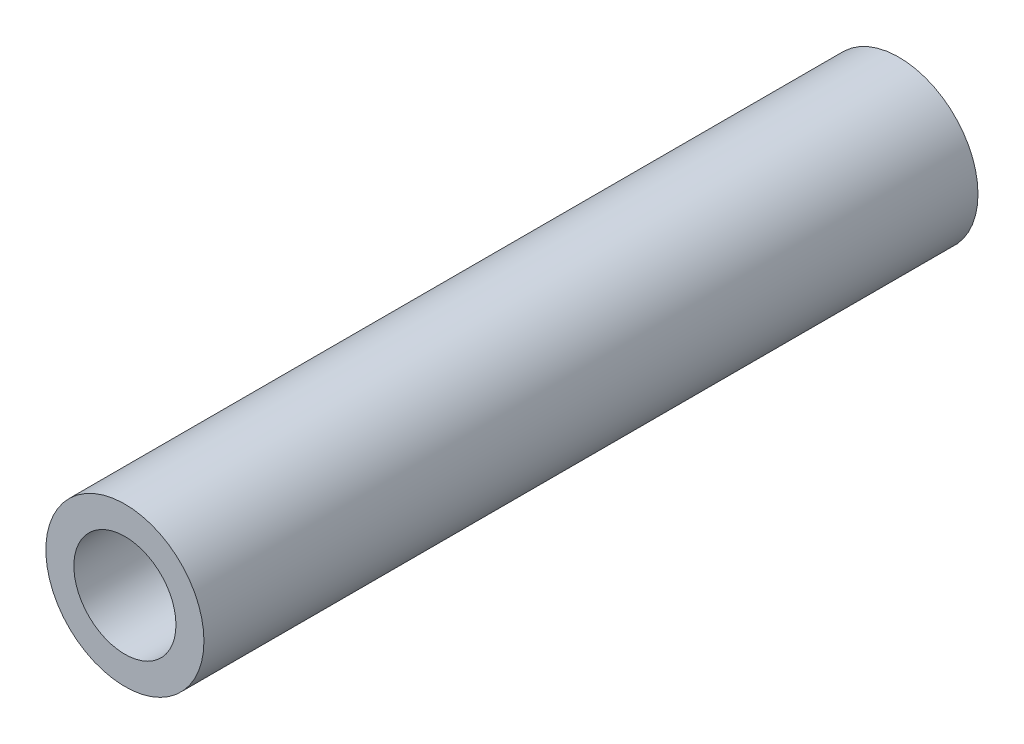
ISO-10303-21;
HEADER;
FILE_DESCRIPTION(('STEP AP214'),'2;1');
FILE_NAME('part.step','',(''),(''),'','','');
FILE_SCHEMA(('AUTOMOTIVE_DESIGN { 1 0 10303 214 1 1 1 1 }'));
ENDSEC;
DATA;
#1=APPLICATION_CONTEXT('core data for automotive mechanical design processes');
#2=APPLICATION_PROTOCOL_DEFINITION('international standard','automotive_design',2000,#1);
#3=PRODUCT_CONTEXT('',#1,'mechanical');
#4=PRODUCT('Part','Part','',(#3));
#5=PRODUCT_RELATED_PRODUCT_CATEGORY('part','',(#4));
#6=PRODUCT_DEFINITION_FORMATION('','',#4);
#7=PRODUCT_DEFINITION_CONTEXT('part definition',#1,'design');
#8=PRODUCT_DEFINITION('design','',#6,#7);
#9=PRODUCT_DEFINITION_SHAPE('','',#8);
#10=(LENGTH_UNIT() NAMED_UNIT(*) SI_UNIT(.MILLI.,.METRE.));
#11=(NAMED_UNIT(*) PLANE_ANGLE_UNIT() SI_UNIT($,.RADIAN.));
#12=(NAMED_UNIT(*) SI_UNIT($,.STERADIAN.) SOLID_ANGLE_UNIT());
#13=UNCERTAINTY_MEASURE_WITH_UNIT(LENGTH_MEASURE(1.E-05),#10,'distance_accuracy_value','');
#14=(GEOMETRIC_REPRESENTATION_CONTEXT(3) GLOBAL_UNCERTAINTY_ASSIGNED_CONTEXT((#13)) GLOBAL_UNIT_ASSIGNED_CONTEXT((#10,
#11,#12)) REPRESENTATION_CONTEXT('',''));
#15=CARTESIAN_POINT('',(0.,0.,0.));
#16=DIRECTION('',(0.,0.,1.));
#17=DIRECTION('',(1.,0.,0.));
#18=AXIS2_PLACEMENT_3D('',#15,#16,#17);
#19=CARTESIAN_POINT('',(0.,0.,23.5));
#20=DIRECTION('',(0.,0.,1.));
#21=DIRECTION('',(1.,0.,0.));
#22=AXIS2_PLACEMENT_3D('',#19,#20,#21);
#23=PLANE('',#22);
#24=CARTESIAN_POINT('',(0.,0.,23.5));
#25=DIRECTION('',(0.,0.,1.));
#26=DIRECTION('',(1.,0.,0.));
#27=AXIS2_PLACEMENT_3D('',#24,#25,#26);
#28=CIRCLE('',#27,2.4);
#29=CARTESIAN_POINT('',(2.4,0.,23.5));
#30=VERTEX_POINT('',#29);
#31=EDGE_CURVE('E10',#30,#30,#28,.T.);
#32=ORIENTED_EDGE('',*,*,#31,.T.);
#33=EDGE_LOOP('',(#32));
#34=FACE_BOUND('',#33,.T.);
#35=CARTESIAN_POINT('',(0.,0.,23.5));
#36=DIRECTION('',(0.,0.,1.));
#37=DIRECTION('',(1.,0.,0.));
#38=AXIS2_PLACEMENT_3D('',#35,#36,#37);
#39=CIRCLE('',#38,1.55);
#40=CARTESIAN_POINT('',(1.55,0.,23.5));
#41=VERTEX_POINT('',#40);
#42=EDGE_CURVE('E42',#41,#41,#39,.T.);
#43=ORIENTED_EDGE('',*,*,#42,.F.);
#44=EDGE_LOOP('',(#43));
#45=FACE_BOUND('',#44,.T.);
#46=ADVANCED_FACE('F31',(#34,#45),#23,.T.);
#47=CARTESIAN_POINT('',(0.,0.,0.));
#48=DIRECTION('',(0.,0.,1.));
#49=DIRECTION('',(1.,0.,0.));
#50=AXIS2_PLACEMENT_3D('',#47,#48,#49);
#51=PLANE('',#50);
#52=CARTESIAN_POINT('',(0.,0.,0.));
#53=DIRECTION('',(0.,0.,1.));
#54=DIRECTION('',(1.,0.,0.));
#55=AXIS2_PLACEMENT_3D('',#52,#53,#54);
#56=CIRCLE('',#55,2.4);
#57=CARTESIAN_POINT('',(2.4,0.,0.));
#58=VERTEX_POINT('',#57);
#59=EDGE_CURVE('E35',#58,#58,#56,.T.);
#60=ORIENTED_EDGE('',*,*,#59,.F.);
#61=EDGE_LOOP('',(#60));
#62=FACE_BOUND('',#61,.T.);
#63=CARTESIAN_POINT('',(0.,0.,0.));
#64=DIRECTION('',(0.,0.,1.));
#65=DIRECTION('',(1.,0.,0.));
#66=AXIS2_PLACEMENT_3D('',#63,#64,#65);
#67=CIRCLE('',#66,1.55);
#68=CARTESIAN_POINT('',(1.55,0.,0.));
#69=VERTEX_POINT('',#68);
#70=EDGE_CURVE('E44',#69,#69,#67,.T.);
#71=ORIENTED_EDGE('',*,*,#70,.T.);
#72=EDGE_LOOP('',(#71));
#73=FACE_BOUND('',#72,.T.);
#74=ADVANCED_FACE('F54',(#62,#73),#51,.F.);
#75=CARTESIAN_POINT('',(0.,0.,23.5));
#76=DIRECTION('',(0.,0.,-1.));
#77=DIRECTION('',(-1.,0.,0.));
#78=AXIS2_PLACEMENT_3D('',#75,#76,#77);
#79=CYLINDRICAL_SURFACE('',#78,2.4);
#80=ORIENTED_EDGE('',*,*,#31,.F.);
#81=EDGE_LOOP('',(#80));
#82=FACE_BOUND('',#81,.T.);
#83=ORIENTED_EDGE('',*,*,#59,.T.);
#84=EDGE_LOOP('',(#83));
#85=FACE_BOUND('',#84,.T.);
#86=ADVANCED_FACE('F33',(#82,#85),#79,.T.);
#87=CARTESIAN_POINT('',(0.,0.,23.5));
#88=DIRECTION('',(0.,0.,-1.));
#89=DIRECTION('',(-1.,0.,0.));
#90=AXIS2_PLACEMENT_3D('',#87,#88,#89);
#91=CYLINDRICAL_SURFACE('',#90,1.55);
#92=ORIENTED_EDGE('',*,*,#42,.T.);
#93=EDGE_LOOP('',(#92));
#94=FACE_BOUND('',#93,.T.);
#95=ORIENTED_EDGE('',*,*,#70,.F.);
#96=EDGE_LOOP('',(#95));
#97=FACE_BOUND('',#96,.T.);
#98=ADVANCED_FACE('F50',(#94,#97),#91,.F.);
#99=CLOSED_SHELL('',(#46,#74,#86,#98));
#100=MANIFOLD_SOLID_BREP('B2',#99);
#101=ADVANCED_BREP_SHAPE_REPRESENTATION('',(#18,#100),#14);
#102=SHAPE_DEFINITION_REPRESENTATION(#9,#101);
ENDSEC;
END-ISO-10303-21;
